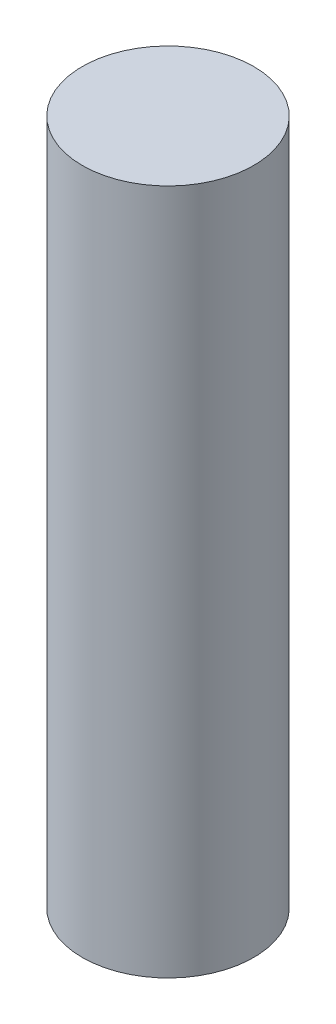
ISO-10303-21;
HEADER;
FILE_DESCRIPTION(('STEP AP214'),'2;1');
FILE_NAME('part.step','',(''),(''),'','','');
FILE_SCHEMA(('AUTOMOTIVE_DESIGN { 1 0 10303 214 1 1 1 1 }'));
ENDSEC;
DATA;
#1=APPLICATION_CONTEXT('core data for automotive mechanical design processes');
#2=APPLICATION_PROTOCOL_DEFINITION('international standard','automotive_design',2000,#1);
#3=PRODUCT_CONTEXT('',#1,'mechanical');
#4=PRODUCT('Part','Part','',(#3));
#5=PRODUCT_RELATED_PRODUCT_CATEGORY('part','',(#4));
#6=PRODUCT_DEFINITION_FORMATION('','',#4);
#7=PRODUCT_DEFINITION_CONTEXT('part definition',#1,'design');
#8=PRODUCT_DEFINITION('design','',#6,#7);
#9=PRODUCT_DEFINITION_SHAPE('','',#8);
#10=(LENGTH_UNIT() NAMED_UNIT(*) SI_UNIT(.MILLI.,.METRE.));
#11=(NAMED_UNIT(*) PLANE_ANGLE_UNIT() SI_UNIT($,.RADIAN.));
#12=(NAMED_UNIT(*) SI_UNIT($,.STERADIAN.) SOLID_ANGLE_UNIT());
#13=UNCERTAINTY_MEASURE_WITH_UNIT(LENGTH_MEASURE(1.E-05),#10,'distance_accuracy_value','');
#14=(GEOMETRIC_REPRESENTATION_CONTEXT(3) GLOBAL_UNCERTAINTY_ASSIGNED_CONTEXT((#13)) GLOBAL_UNIT_ASSIGNED_CONTEXT((#10,
#11,#12)) REPRESENTATION_CONTEXT('',''));
#15=CARTESIAN_POINT('',(0.,0.,0.));
#16=DIRECTION('',(0.,0.,1.));
#17=DIRECTION('',(1.,0.,0.));
#18=AXIS2_PLACEMENT_3D('',#15,#16,#17);
#19=CARTESIAN_POINT('',(0.,80.,0.));
#20=DIRECTION('',(0.,-1.,0.));
#21=DIRECTION('',(0.,0.,-1.));
#22=AXIS2_PLACEMENT_3D('',#19,#20,#21);
#23=CYLINDRICAL_SURFACE('',#22,10.);
#24=CARTESIAN_POINT('',(0.,80.,0.));
#25=DIRECTION('',(0.,1.,0.));
#26=DIRECTION('',(0.,0.,1.));
#27=AXIS2_PLACEMENT_3D('',#24,#25,#26);
#28=CIRCLE('',#27,10.);
#29=CARTESIAN_POINT('',(0.,80.,10.));
#30=VERTEX_POINT('',#29);
#31=EDGE_CURVE('E10',#30,#30,#28,.T.);
#32=ORIENTED_EDGE('',*,*,#31,.F.);
#33=EDGE_LOOP('',(#32));
#34=FACE_BOUND('',#33,.T.);
#35=CARTESIAN_POINT('',(0.,0.,0.));
#36=DIRECTION('',(0.,1.,0.));
#37=DIRECTION('',(0.,0.,1.));
#38=AXIS2_PLACEMENT_3D('',#35,#36,#37);
#39=CIRCLE('',#38,10.);
#40=CARTESIAN_POINT('',(0.,0.,10.));
#41=VERTEX_POINT('',#40);
#42=EDGE_CURVE('E34',#41,#41,#39,.T.);
#43=ORIENTED_EDGE('',*,*,#42,.T.);
#44=EDGE_LOOP('',(#43));
#45=FACE_BOUND('',#44,.T.);
#46=ADVANCED_FACE('F31',(#34,#45),#23,.T.);
#47=CARTESIAN_POINT('',(0.,80.,0.));
#48=DIRECTION('',(0.,1.,0.));
#49=DIRECTION('',(0.,0.,1.));
#50=AXIS2_PLACEMENT_3D('',#47,#48,#49);
#51=PLANE('',#50);
#52=ORIENTED_EDGE('',*,*,#31,.T.);
#53=EDGE_LOOP('',(#52));
#54=FACE_BOUND('',#53,.T.);
#55=ADVANCED_FACE('F46',(#54),#51,.T.);
#56=CARTESIAN_POINT('',(0.,0.,0.));
#57=DIRECTION('',(0.,1.,0.));
#58=DIRECTION('',(0.,0.,1.));
#59=AXIS2_PLACEMENT_3D('',#56,#57,#58);
#60=PLANE('',#59);
#61=ORIENTED_EDGE('',*,*,#42,.F.);
#62=EDGE_LOOP('',(#61));
#63=FACE_BOUND('',#62,.T.);
#64=ADVANCED_FACE('F44',(#63),#60,.F.);
#65=CLOSED_SHELL('',(#46,#55,#64));
#66=MANIFOLD_SOLID_BREP('B2',#65);
#67=ADVANCED_BREP_SHAPE_REPRESENTATION('',(#18,#66),#14);
#68=SHAPE_DEFINITION_REPRESENTATION(#9,#67);
ENDSEC;
END-ISO-10303-21;
